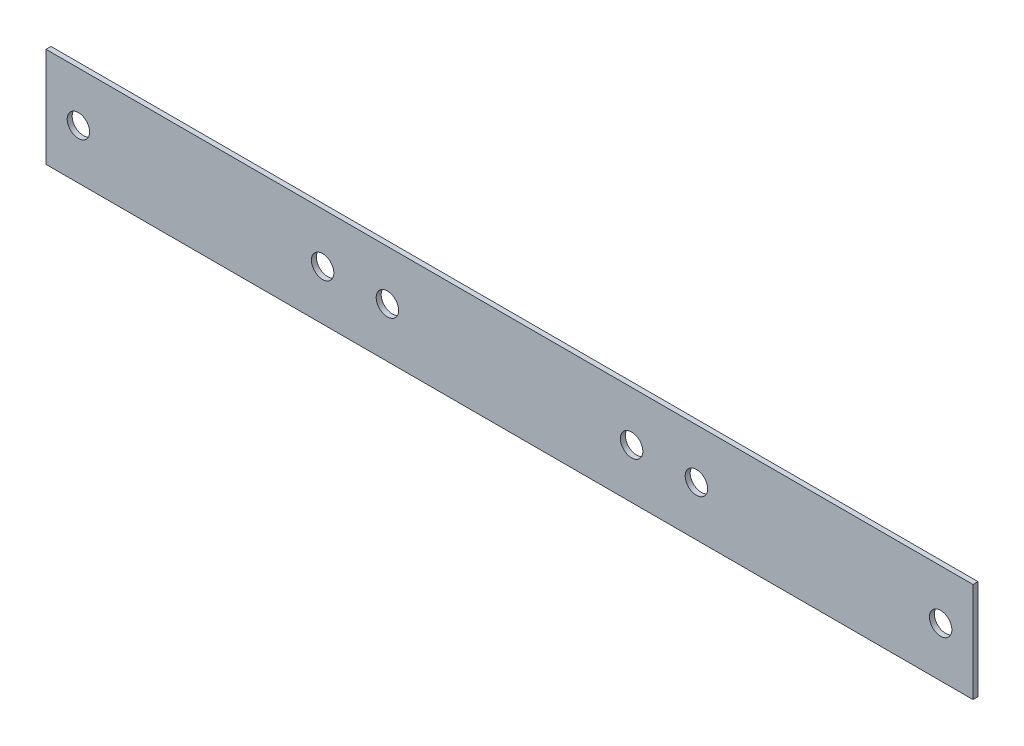
ISO-10303-21;
HEADER;
FILE_DESCRIPTION(('STEP AP214'),'2;1');
FILE_NAME('part.step','',(''),(''),'','','');
FILE_SCHEMA(('AUTOMOTIVE_DESIGN { 1 0 10303 214 1 1 1 1 }'));
ENDSEC;
DATA;
#1=APPLICATION_CONTEXT('core data for automotive mechanical design processes');
#2=APPLICATION_PROTOCOL_DEFINITION('international standard','automotive_design',2000,#1);
#3=PRODUCT_CONTEXT('',#1,'mechanical');
#4=PRODUCT('Part','Part','',(#3));
#5=PRODUCT_RELATED_PRODUCT_CATEGORY('part','',(#4));
#6=PRODUCT_DEFINITION_FORMATION('','',#4);
#7=PRODUCT_DEFINITION_CONTEXT('part definition',#1,'design');
#8=PRODUCT_DEFINITION('design','',#6,#7);
#9=PRODUCT_DEFINITION_SHAPE('','',#8);
#10=(LENGTH_UNIT() NAMED_UNIT(*) SI_UNIT(.MILLI.,.METRE.));
#11=(NAMED_UNIT(*) PLANE_ANGLE_UNIT() SI_UNIT($,.RADIAN.));
#12=(NAMED_UNIT(*) SI_UNIT($,.STERADIAN.) SOLID_ANGLE_UNIT());
#13=UNCERTAINTY_MEASURE_WITH_UNIT(LENGTH_MEASURE(1.E-05),#10,'distance_accuracy_value','');
#14=(GEOMETRIC_REPRESENTATION_CONTEXT(3) GLOBAL_UNCERTAINTY_ASSIGNED_CONTEXT((#13)) GLOBAL_UNIT_ASSIGNED_CONTEXT((#10,
#11,#12)) REPRESENTATION_CONTEXT('',''));
#15=CARTESIAN_POINT('',(0.,0.,0.));
#16=DIRECTION('',(0.,0.,1.));
#17=DIRECTION('',(1.,0.,0.));
#18=AXIS2_PLACEMENT_3D('',#15,#16,#17);
#19=CARTESIAN_POINT('',(0.,0.,1.));
#20=DIRECTION('',(0.,0.,1.));
#21=DIRECTION('',(1.,0.,0.));
#22=AXIS2_PLACEMENT_3D('',#19,#20,#21);
#23=PLANE('',#22);
#24=CARTESIAN_POINT('',(31.5,0.,1.));
#25=DIRECTION('',(0.,0.,1.));
#26=DIRECTION('',(1.,0.,0.));
#27=AXIS2_PLACEMENT_3D('',#24,#25,#26);
#28=CIRCLE('',#27,2.25);
#29=CARTESIAN_POINT('',(33.75,0.,1.));
#30=VERTEX_POINT('',#29);
#31=EDGE_CURVE('E139',#30,#30,#28,.T.);
#32=ORIENTED_EDGE('',*,*,#31,.F.);
#33=EDGE_LOOP('',(#32));
#34=FACE_BOUND('',#33,.T.);
#35=CARTESIAN_POINT('',(-30.5,0.,1.));
#36=DIRECTION('',(0.,0.,1.));
#37=DIRECTION('',(1.,0.,0.));
#38=AXIS2_PLACEMENT_3D('',#35,#36,#37);
#39=CIRCLE('',#38,2.25);
#40=CARTESIAN_POINT('',(-28.25,0.,1.));
#41=VERTEX_POINT('',#40);
#42=EDGE_CURVE('E127',#41,#41,#39,.T.);
#43=ORIENTED_EDGE('',*,*,#42,.F.);
#44=EDGE_LOOP('',(#43));
#45=FACE_BOUND('',#44,.T.);
#46=CARTESIAN_POINT('',(-92.5,0.,1.));
#47=DIRECTION('',(0.,0.,1.));
#48=DIRECTION('',(1.,0.,0.));
#49=AXIS2_PLACEMENT_3D('',#46,#47,#48);
#50=CIRCLE('',#49,2.25);
#51=CARTESIAN_POINT('',(-90.25,0.,1.));
#52=VERTEX_POINT('',#51);
#53=EDGE_CURVE('E106',#52,#52,#50,.T.);
#54=ORIENTED_EDGE('',*,*,#53,.F.);
#55=EDGE_LOOP('',(#54));
#56=FACE_BOUND('',#55,.T.);
#57=DIRECTION('',(0.,-1.,0.));
#58=VECTOR('',#57,1.);
#59=CARTESIAN_POINT('',(-99.,10.,1.));
#60=LINE('',#59,#58);
#61=CARTESIAN_POINT('',(-99.,10.,1.));
#62=VERTEX_POINT('',#61);
#63=CARTESIAN_POINT('',(-99.,-10.,1.));
#64=VERTEX_POINT('',#63);
#65=EDGE_CURVE('E91',#62,#64,#60,.T.);
#66=ORIENTED_EDGE('',*,*,#65,.T.);
#67=DIRECTION('',(1.,0.,0.));
#68=VECTOR('',#67,1.);
#69=CARTESIAN_POINT('',(-99.,-10.,1.));
#70=LINE('',#69,#68);
#71=CARTESIAN_POINT('',(87.,-10.,1.));
#72=VERTEX_POINT('',#71);
#73=EDGE_CURVE('E86',#64,#72,#70,.T.);
#74=ORIENTED_EDGE('',*,*,#73,.T.);
#75=DIRECTION('',(0.,1.,0.));
#76=VECTOR('',#75,1.);
#77=CARTESIAN_POINT('',(87.,-10.,1.));
#78=LINE('',#77,#76);
#79=CARTESIAN_POINT('',(87.,10.,1.));
#80=VERTEX_POINT('',#79);
#81=EDGE_CURVE('E89',#72,#80,#78,.T.);
#82=ORIENTED_EDGE('',*,*,#81,.T.);
#83=DIRECTION('',(-1.,0.,0.));
#84=VECTOR('',#83,1.);
#85=CARTESIAN_POINT('',(87.,10.,1.));
#86=LINE('',#85,#84);
#87=EDGE_CURVE('E56',#80,#62,#86,.T.);
#88=ORIENTED_EDGE('',*,*,#87,.T.);
#89=EDGE_LOOP('',(#66,#74,#82,#88));
#90=FACE_BOUND('',#89,.T.);
#91=CARTESIAN_POINT('',(-43.5,0.,1.));
#92=DIRECTION('',(0.,0.,1.));
#93=DIRECTION('',(1.,0.,0.));
#94=AXIS2_PLACEMENT_3D('',#91,#92,#93);
#95=CIRCLE('',#94,2.25);
#96=CARTESIAN_POINT('',(-41.25,0.,1.));
#97=VERTEX_POINT('',#96);
#98=EDGE_CURVE('E121',#97,#97,#95,.T.);
#99=ORIENTED_EDGE('',*,*,#98,.F.);
#100=EDGE_LOOP('',(#99));
#101=FACE_BOUND('',#100,.T.);
#102=CARTESIAN_POINT('',(18.5,0.,1.));
#103=DIRECTION('',(0.,0.,1.));
#104=DIRECTION('',(1.,0.,0.));
#105=AXIS2_PLACEMENT_3D('',#102,#103,#104);
#106=CIRCLE('',#105,2.25);
#107=CARTESIAN_POINT('',(20.75,0.,1.));
#108=VERTEX_POINT('',#107);
#109=EDGE_CURVE('E133',#108,#108,#106,.T.);
#110=ORIENTED_EDGE('',*,*,#109,.F.);
#111=EDGE_LOOP('',(#110));
#112=FACE_BOUND('',#111,.T.);
#113=CARTESIAN_POINT('',(80.5,0.,1.));
#114=DIRECTION('',(0.,0.,1.));
#115=DIRECTION('',(1.,0.,0.));
#116=AXIS2_PLACEMENT_3D('',#113,#114,#115);
#117=CIRCLE('',#116,2.25);
#118=CARTESIAN_POINT('',(82.75,0.,1.));
#119=VERTEX_POINT('',#118);
#120=EDGE_CURVE('E145',#119,#119,#117,.T.);
#121=ORIENTED_EDGE('',*,*,#120,.F.);
#122=EDGE_LOOP('',(#121));
#123=FACE_BOUND('',#122,.T.);
#124=ADVANCED_FACE('F39',(#34,#45,#56,#90,#101,#112,#123),#23,.T.);
#125=CARTESIAN_POINT('',(0.,0.,0.));
#126=DIRECTION('',(0.,0.,1.));
#127=DIRECTION('',(1.,0.,0.));
#128=AXIS2_PLACEMENT_3D('',#125,#126,#127);
#129=PLANE('',#128);
#130=DIRECTION('',(0.,-1.,0.));
#131=VECTOR('',#130,1.);
#132=CARTESIAN_POINT('',(-99.,10.,0.));
#133=LINE('',#132,#131);
#134=CARTESIAN_POINT('',(-99.,10.,0.));
#135=VERTEX_POINT('',#134);
#136=CARTESIAN_POINT('',(-99.,-10.,0.));
#137=VERTEX_POINT('',#136);
#138=EDGE_CURVE('E103',#135,#137,#133,.T.);
#139=ORIENTED_EDGE('',*,*,#138,.F.);
#140=DIRECTION('',(-1.,0.,0.));
#141=VECTOR('',#140,1.);
#142=CARTESIAN_POINT('',(87.,10.,0.));
#143=LINE('',#142,#141);
#144=CARTESIAN_POINT('',(87.,10.,0.));
#145=VERTEX_POINT('',#144);
#146=EDGE_CURVE('E79',#145,#135,#143,.T.);
#147=ORIENTED_EDGE('',*,*,#146,.F.);
#148=DIRECTION('',(0.,1.,0.));
#149=VECTOR('',#148,1.);
#150=CARTESIAN_POINT('',(87.,-10.,0.));
#151=LINE('',#150,#149);
#152=CARTESIAN_POINT('',(87.,-10.,0.));
#153=VERTEX_POINT('',#152);
#154=EDGE_CURVE('E73',#153,#145,#151,.T.);
#155=ORIENTED_EDGE('',*,*,#154,.F.);
#156=DIRECTION('',(1.,0.,0.));
#157=VECTOR('',#156,1.);
#158=CARTESIAN_POINT('',(-99.,-10.,0.));
#159=LINE('',#158,#157);
#160=EDGE_CURVE('E95',#137,#153,#159,.T.);
#161=ORIENTED_EDGE('',*,*,#160,.F.);
#162=EDGE_LOOP('',(#139,#147,#155,#161));
#163=FACE_BOUND('',#162,.T.);
#164=CARTESIAN_POINT('',(-92.5,0.,0.));
#165=DIRECTION('',(0.,0.,1.));
#166=DIRECTION('',(1.,0.,0.));
#167=AXIS2_PLACEMENT_3D('',#164,#165,#166);
#168=CIRCLE('',#167,2.25);
#169=CARTESIAN_POINT('',(-90.25,0.,0.));
#170=VERTEX_POINT('',#169);
#171=EDGE_CURVE('E118',#170,#170,#168,.T.);
#172=ORIENTED_EDGE('',*,*,#171,.T.);
#173=EDGE_LOOP('',(#172));
#174=FACE_BOUND('',#173,.T.);
#175=CARTESIAN_POINT('',(-43.5,0.,0.));
#176=DIRECTION('',(0.,0.,1.));
#177=DIRECTION('',(1.,0.,0.));
#178=AXIS2_PLACEMENT_3D('',#175,#176,#177);
#179=CIRCLE('',#178,2.25);
#180=CARTESIAN_POINT('',(-41.25,0.,0.));
#181=VERTEX_POINT('',#180);
#182=EDGE_CURVE('E124',#181,#181,#179,.T.);
#183=ORIENTED_EDGE('',*,*,#182,.T.);
#184=EDGE_LOOP('',(#183));
#185=FACE_BOUND('',#184,.T.);
#186=CARTESIAN_POINT('',(-30.5,0.,0.));
#187=DIRECTION('',(0.,0.,1.));
#188=DIRECTION('',(1.,0.,0.));
#189=AXIS2_PLACEMENT_3D('',#186,#187,#188);
#190=CIRCLE('',#189,2.25);
#191=CARTESIAN_POINT('',(-28.25,0.,0.));
#192=VERTEX_POINT('',#191);
#193=EDGE_CURVE('E130',#192,#192,#190,.T.);
#194=ORIENTED_EDGE('',*,*,#193,.T.);
#195=EDGE_LOOP('',(#194));
#196=FACE_BOUND('',#195,.T.);
#197=CARTESIAN_POINT('',(18.5,0.,0.));
#198=DIRECTION('',(0.,0.,1.));
#199=DIRECTION('',(1.,0.,0.));
#200=AXIS2_PLACEMENT_3D('',#197,#198,#199);
#201=CIRCLE('',#200,2.25);
#202=CARTESIAN_POINT('',(20.75,0.,0.));
#203=VERTEX_POINT('',#202);
#204=EDGE_CURVE('E136',#203,#203,#201,.T.);
#205=ORIENTED_EDGE('',*,*,#204,.T.);
#206=EDGE_LOOP('',(#205));
#207=FACE_BOUND('',#206,.T.);
#208=CARTESIAN_POINT('',(31.5,0.,0.));
#209=DIRECTION('',(0.,0.,1.));
#210=DIRECTION('',(1.,0.,0.));
#211=AXIS2_PLACEMENT_3D('',#208,#209,#210);
#212=CIRCLE('',#211,2.25);
#213=CARTESIAN_POINT('',(33.75,0.,0.));
#214=VERTEX_POINT('',#213);
#215=EDGE_CURVE('E142',#214,#214,#212,.T.);
#216=ORIENTED_EDGE('',*,*,#215,.T.);
#217=EDGE_LOOP('',(#216));
#218=FACE_BOUND('',#217,.T.);
#219=CARTESIAN_POINT('',(80.5,0.,0.));
#220=DIRECTION('',(0.,0.,1.));
#221=DIRECTION('',(1.,0.,0.));
#222=AXIS2_PLACEMENT_3D('',#219,#220,#221);
#223=CIRCLE('',#222,2.25);
#224=CARTESIAN_POINT('',(82.75,0.,0.));
#225=VERTEX_POINT('',#224);
#226=EDGE_CURVE('E148',#225,#225,#223,.T.);
#227=ORIENTED_EDGE('',*,*,#226,.T.);
#228=EDGE_LOOP('',(#227));
#229=FACE_BOUND('',#228,.T.);
#230=ADVANCED_FACE('F114',(#163,#174,#185,#196,#207,#218,#229),#129,.F.);
#231=CARTESIAN_POINT('',(-99.,10.,1.));
#232=DIRECTION('',(1.,0.,0.));
#233=DIRECTION('',(0.,0.,-1.));
#234=AXIS2_PLACEMENT_3D('',#231,#232,#233);
#235=PLANE('',#234);
#236=ORIENTED_EDGE('',*,*,#138,.T.);
#237=DIRECTION('',(0.,0.,-1.));
#238=VECTOR('',#237,1.);
#239=CARTESIAN_POINT('',(-99.,-10.,1.));
#240=LINE('',#239,#238);
#241=EDGE_CURVE('E11',#64,#137,#240,.T.);
#242=ORIENTED_EDGE('',*,*,#241,.F.);
#243=ORIENTED_EDGE('',*,*,#65,.F.);
#244=DIRECTION('',(0.,0.,-1.));
#245=VECTOR('',#244,1.);
#246=CARTESIAN_POINT('',(-99.,10.,1.));
#247=LINE('',#246,#245);
#248=EDGE_CURVE('E99',#62,#135,#247,.T.);
#249=ORIENTED_EDGE('',*,*,#248,.T.);
#250=EDGE_LOOP('',(#236,#242,#243,#249));
#251=FACE_BOUND('',#250,.T.);
#252=ADVANCED_FACE('F41',(#251),#235,.F.);
#253=CARTESIAN_POINT('',(-99.,-10.,1.));
#254=DIRECTION('',(0.,1.,0.));
#255=DIRECTION('',(0.,0.,1.));
#256=AXIS2_PLACEMENT_3D('',#253,#254,#255);
#257=PLANE('',#256);
#258=ORIENTED_EDGE('',*,*,#160,.T.);
#259=DIRECTION('',(0.,0.,-1.));
#260=VECTOR('',#259,1.);
#261=CARTESIAN_POINT('',(87.,-10.,1.));
#262=LINE('',#261,#260);
#263=EDGE_CURVE('E48',#72,#153,#262,.T.);
#264=ORIENTED_EDGE('',*,*,#263,.F.);
#265=ORIENTED_EDGE('',*,*,#73,.F.);
#266=ORIENTED_EDGE('',*,*,#241,.T.);
#267=EDGE_LOOP('',(#258,#264,#265,#266));
#268=FACE_BOUND('',#267,.T.);
#269=ADVANCED_FACE('F94',(#268),#257,.F.);
#270=CARTESIAN_POINT('',(87.,-10.,1.));
#271=DIRECTION('',(-1.,0.,0.));
#272=DIRECTION('',(0.,0.,1.));
#273=AXIS2_PLACEMENT_3D('',#270,#271,#272);
#274=PLANE('',#273);
#275=ORIENTED_EDGE('',*,*,#154,.T.);
#276=DIRECTION('',(0.,0.,-1.));
#277=VECTOR('',#276,1.);
#278=CARTESIAN_POINT('',(87.,10.,1.));
#279=LINE('',#278,#277);
#280=EDGE_CURVE('E96',#80,#145,#279,.T.);
#281=ORIENTED_EDGE('',*,*,#280,.F.);
#282=ORIENTED_EDGE('',*,*,#81,.F.);
#283=ORIENTED_EDGE('',*,*,#263,.T.);
#284=EDGE_LOOP('',(#275,#281,#282,#283));
#285=FACE_BOUND('',#284,.T.);
#286=ADVANCED_FACE('F97',(#285),#274,.F.);
#287=CARTESIAN_POINT('',(87.,10.,1.));
#288=DIRECTION('',(0.,-1.,0.));
#289=DIRECTION('',(0.,0.,-1.));
#290=AXIS2_PLACEMENT_3D('',#287,#288,#289);
#291=PLANE('',#290);
#292=ORIENTED_EDGE('',*,*,#146,.T.);
#293=ORIENTED_EDGE('',*,*,#248,.F.);
#294=ORIENTED_EDGE('',*,*,#87,.F.);
#295=ORIENTED_EDGE('',*,*,#280,.T.);
#296=EDGE_LOOP('',(#292,#293,#294,#295));
#297=FACE_BOUND('',#296,.T.);
#298=ADVANCED_FACE('F111',(#297),#291,.F.);
#299=CARTESIAN_POINT('',(-92.5,0.,1.));
#300=DIRECTION('',(0.,0.,-1.));
#301=DIRECTION('',(-1.,0.,0.));
#302=AXIS2_PLACEMENT_3D('',#299,#300,#301);
#303=CYLINDRICAL_SURFACE('',#302,2.25);
#304=ORIENTED_EDGE('',*,*,#53,.T.);
#305=EDGE_LOOP('',(#304));
#306=FACE_BOUND('',#305,.T.);
#307=ORIENTED_EDGE('',*,*,#171,.F.);
#308=EDGE_LOOP('',(#307));
#309=FACE_BOUND('',#308,.T.);
#310=ADVANCED_FACE('F167',(#306,#309),#303,.F.);
#311=CARTESIAN_POINT('',(-43.5,0.,1.));
#312=DIRECTION('',(0.,0.,-1.));
#313=DIRECTION('',(-1.,0.,0.));
#314=AXIS2_PLACEMENT_3D('',#311,#312,#313);
#315=CYLINDRICAL_SURFACE('',#314,2.25);
#316=ORIENTED_EDGE('',*,*,#98,.T.);
#317=EDGE_LOOP('',(#316));
#318=FACE_BOUND('',#317,.T.);
#319=ORIENTED_EDGE('',*,*,#182,.F.);
#320=EDGE_LOOP('',(#319));
#321=FACE_BOUND('',#320,.T.);
#322=ADVANCED_FACE('F212',(#318,#321),#315,.F.);
#323=CARTESIAN_POINT('',(-30.5,0.,1.));
#324=DIRECTION('',(0.,0.,-1.));
#325=DIRECTION('',(-1.,0.,0.));
#326=AXIS2_PLACEMENT_3D('',#323,#324,#325);
#327=CYLINDRICAL_SURFACE('',#326,2.25);
#328=ORIENTED_EDGE('',*,*,#42,.T.);
#329=EDGE_LOOP('',(#328));
#330=FACE_BOUND('',#329,.T.);
#331=ORIENTED_EDGE('',*,*,#193,.F.);
#332=EDGE_LOOP('',(#331));
#333=FACE_BOUND('',#332,.T.);
#334=ADVANCED_FACE('F220',(#330,#333),#327,.F.);
#335=CARTESIAN_POINT('',(18.5,0.,1.));
#336=DIRECTION('',(0.,0.,-1.));
#337=DIRECTION('',(-1.,0.,0.));
#338=AXIS2_PLACEMENT_3D('',#335,#336,#337);
#339=CYLINDRICAL_SURFACE('',#338,2.25);
#340=ORIENTED_EDGE('',*,*,#109,.T.);
#341=EDGE_LOOP('',(#340));
#342=FACE_BOUND('',#341,.T.);
#343=ORIENTED_EDGE('',*,*,#204,.F.);
#344=EDGE_LOOP('',(#343));
#345=FACE_BOUND('',#344,.T.);
#346=ADVANCED_FACE('F228',(#342,#345),#339,.F.);
#347=CARTESIAN_POINT('',(31.5,0.,1.));
#348=DIRECTION('',(0.,0.,-1.));
#349=DIRECTION('',(-1.,0.,0.));
#350=AXIS2_PLACEMENT_3D('',#347,#348,#349);
#351=CYLINDRICAL_SURFACE('',#350,2.25);
#352=ORIENTED_EDGE('',*,*,#31,.T.);
#353=EDGE_LOOP('',(#352));
#354=FACE_BOUND('',#353,.T.);
#355=ORIENTED_EDGE('',*,*,#215,.F.);
#356=EDGE_LOOP('',(#355));
#357=FACE_BOUND('',#356,.T.);
#358=ADVANCED_FACE('F237',(#354,#357),#351,.F.);
#359=CARTESIAN_POINT('',(80.5,0.,1.));
#360=DIRECTION('',(0.,0.,-1.));
#361=DIRECTION('',(-1.,0.,0.));
#362=AXIS2_PLACEMENT_3D('',#359,#360,#361);
#363=CYLINDRICAL_SURFACE('',#362,2.25);
#364=ORIENTED_EDGE('',*,*,#120,.T.);
#365=EDGE_LOOP('',(#364));
#366=FACE_BOUND('',#365,.T.);
#367=ORIENTED_EDGE('',*,*,#226,.F.);
#368=EDGE_LOOP('',(#367));
#369=FACE_BOUND('',#368,.T.);
#370=ADVANCED_FACE('F154',(#366,#369),#363,.F.);
#371=CLOSED_SHELL('',(#124,#230,#252,#269,#286,#298,#310,#322,#334,#346,#358,#370));
#372=MANIFOLD_SOLID_BREP('B2',#371);
#373=ADVANCED_BREP_SHAPE_REPRESENTATION('',(#18,#372),#14);
#374=SHAPE_DEFINITION_REPRESENTATION(#9,#373);
ENDSEC;
END-ISO-10303-21;
